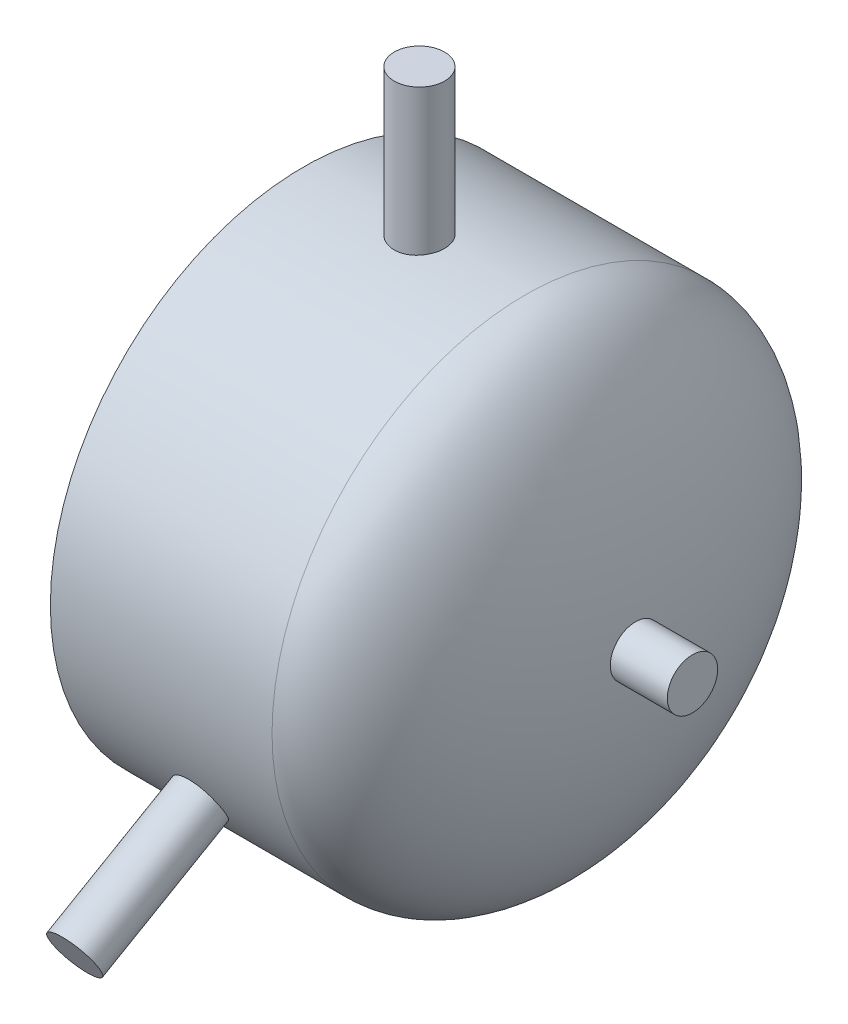
ISO-10303-21;
HEADER;
FILE_DESCRIPTION(('STEP AP214'),'2;1');
FILE_NAME('part.step','',(''),(''),'','','');
FILE_SCHEMA(('AUTOMOTIVE_DESIGN { 1 0 10303 214 1 1 1 1 }'));
ENDSEC;
DATA;
#1=APPLICATION_CONTEXT('core data for automotive mechanical design processes');
#2=APPLICATION_PROTOCOL_DEFINITION('international standard','automotive_design',2000,#1);
#3=PRODUCT_CONTEXT('',#1,'mechanical');
#4=PRODUCT('Part','Part','',(#3));
#5=PRODUCT_RELATED_PRODUCT_CATEGORY('part','',(#4));
#6=PRODUCT_DEFINITION_FORMATION('','',#4);
#7=PRODUCT_DEFINITION_CONTEXT('part definition',#1,'design');
#8=PRODUCT_DEFINITION('design','',#6,#7);
#9=PRODUCT_DEFINITION_SHAPE('','',#8);
#10=(LENGTH_UNIT() NAMED_UNIT(*) SI_UNIT(.MILLI.,.METRE.));
#11=(NAMED_UNIT(*) PLANE_ANGLE_UNIT() SI_UNIT($,.RADIAN.));
#12=(NAMED_UNIT(*) SI_UNIT($,.STERADIAN.) SOLID_ANGLE_UNIT());
#13=UNCERTAINTY_MEASURE_WITH_UNIT(LENGTH_MEASURE(1.E-05),#10,'distance_accuracy_value','');
#14=(GEOMETRIC_REPRESENTATION_CONTEXT(3) GLOBAL_UNCERTAINTY_ASSIGNED_CONTEXT((#13)) GLOBAL_UNIT_ASSIGNED_CONTEXT((#10,
#11,#12)) REPRESENTATION_CONTEXT('',''));
#15=CARTESIAN_POINT('',(0.,0.,0.));
#16=DIRECTION('',(0.,0.,1.));
#17=DIRECTION('',(1.,0.,0.));
#18=AXIS2_PLACEMENT_3D('',#15,#16,#17);
#19=CARTESIAN_POINT('',(38.1,0.,0.));
#20=DIRECTION('',(1.,0.,0.));
#21=DIRECTION('',(0.,0.,-1.));
#22=AXIS2_PLACEMENT_3D('',#19,#20,#21);
#23=PLANE('',#22);
#24=CARTESIAN_POINT('',(38.1,0.,0.));
#25=DIRECTION('',(-1.,0.,0.));
#26=DIRECTION('',(0.,0.,1.));
#27=AXIS2_PLACEMENT_3D('',#24,#25,#26);
#28=CIRCLE('',#27,6.35);
#29=CARTESIAN_POINT('',(38.1,0.,6.35));
#30=VERTEX_POINT('',#29);
#31=EDGE_CURVE('E11',#30,#30,#28,.T.);
#32=ORIENTED_EDGE('',*,*,#31,.T.);
#33=EDGE_LOOP('',(#32));
#34=FACE_BOUND('',#33,.T.);
#35=ADVANCED_FACE('F39',(#34),#23,.F.);
#36=CARTESIAN_POINT('',(-1078.06390114847,0.,0.));
#37=DIRECTION('',(-1.,0.,0.));
#38=DIRECTION('',(0.,0.,1.));
#39=AXIS2_PLACEMENT_3D('',#36,#37,#38);
#40=CYLINDRICAL_SURFACE('',#39,6.35);
#41=ORIENTED_EDGE('',*,*,#31,.F.);
#42=EDGE_LOOP('',(#41));
#43=FACE_BOUND('',#42,.T.);
#44=CARTESIAN_POINT('',(56.1339999999999,0.,0.));
#45=DIRECTION('',(-1.,0.,0.));
#46=DIRECTION('',(0.,0.,1.));
#47=AXIS2_PLACEMENT_3D('',#44,#45,#46);
#48=CIRCLE('',#47,6.35);
#49=CARTESIAN_POINT('',(56.1339999999999,0.,6.35));
#50=VERTEX_POINT('',#49);
#51=EDGE_CURVE('E45',#50,#50,#48,.T.);
#52=ORIENTED_EDGE('',*,*,#51,.T.);
#53=EDGE_LOOP('',(#52));
#54=FACE_BOUND('',#53,.T.);
#55=ADVANCED_FACE('F51',(#43,#54),#40,.T.);
#56=CARTESIAN_POINT('',(56.134,0.,0.));
#57=DIRECTION('',(-1.,0.,0.));
#58=DIRECTION('',(0.,0.,1.));
#59=AXIS2_PLACEMENT_3D('',#56,#57,#58);
#60=PLANE('',#59);
#61=ORIENTED_EDGE('',*,*,#51,.F.);
#62=EDGE_LOOP('',(#61));
#63=FACE_BOUND('',#62,.T.);
#64=ADVANCED_FACE('F53',(#63),#60,.F.);
#65=CLOSED_SHELL('',(#35,#55,#64));
#66=MANIFOLD_SOLID_BREP('B2',#65);
#67=CARTESIAN_POINT('',(-12.7,453.474919861809,785.441601158895));
#68=DIRECTION('',(0.,0.499999999999992,0.866025403784443));
#69=DIRECTION('',(0.,-0.866025403784443,0.499999999999992));
#70=AXIS2_PLACEMENT_3D('',#67,#68,#69);
#71=CYLINDRICAL_SURFACE('',#70,6.34999999999999);
#72=CARTESIAN_POINT('',(-12.7,-28.9559999999995,-50.1532631839646));
#73=DIRECTION('',(0.,0.499999999999992,0.866025403784443));
#74=DIRECTION('',(0.,-0.866025403784443,0.499999999999992));
#75=AXIS2_PLACEMENT_3D('',#72,#73,#74);
#76=CIRCLE('',#75,6.34999999999999);
#77=CARTESIAN_POINT('',(-12.7,-34.4552613140307,-46.9782631839647));
#78=VERTEX_POINT('',#77);
#79=EDGE_CURVE('E38',#78,#78,#76,.T.);
#80=ORIENTED_EDGE('',*,*,#79,.F.);
#81=EDGE_LOOP('',(#80));
#82=FACE_BOUND('',#81,.T.);
#83=CARTESIAN_POINT('',(-12.7,-50.1649999999992,-86.8883287616932));
#84=DIRECTION('',(0.,0.499999999999992,0.866025403784443));
#85=DIRECTION('',(0.,-0.866025403784443,0.499999999999992));
#86=AXIS2_PLACEMENT_3D('',#83,#84,#85);
#87=CIRCLE('',#86,6.35);
#88=CARTESIAN_POINT('',(-12.7,-55.6642613140304,-83.7133287616933));
#89=VERTEX_POINT('',#88);
#90=EDGE_CURVE('E93',#89,#89,#87,.T.);
#91=ORIENTED_EDGE('',*,*,#90,.T.);
#92=EDGE_LOOP('',(#91));
#93=FACE_BOUND('',#92,.T.);
#94=ADVANCED_FACE('F87',(#82,#93),#71,.T.);
#95=CARTESIAN_POINT('',(-19.05,-28.9559999999995,-50.1532631839647));
#96=DIRECTION('',(0.,-0.499999999999992,-0.866025403784443));
#97=DIRECTION('',(0.,0.866025403784443,-0.499999999999992));
#98=AXIS2_PLACEMENT_3D('',#95,#96,#97);
#99=PLANE('',#98);
#100=ORIENTED_EDGE('',*,*,#79,.T.);
#101=EDGE_LOOP('',(#100));
#102=FACE_BOUND('',#101,.T.);
#103=ADVANCED_FACE('F102',(#102),#99,.F.);
#104=CARTESIAN_POINT('',(-19.05,-50.1649999999992,-86.8883287616932));
#105=DIRECTION('',(0.,0.499999999999992,0.866025403784443));
#106=DIRECTION('',(0.,-0.866025403784443,0.499999999999992));
#107=AXIS2_PLACEMENT_3D('',#104,#105,#106);
#108=PLANE('',#107);
#109=ORIENTED_EDGE('',*,*,#90,.F.);
#110=EDGE_LOOP('',(#109));
#111=FACE_BOUND('',#110,.T.);
#112=ADVANCED_FACE('F100',(#111),#108,.F.);
#113=CLOSED_SHELL('',(#94,#103,#112));
#114=MANIFOLD_SOLID_BREP('B6',#113);
#115=CARTESIAN_POINT('',(-12.7,453.47491986182,-785.441601158888));
#116=DIRECTION('',(0.,0.500000000000004,-0.866025403784436));
#117=DIRECTION('',(0.,0.866025403784436,0.500000000000004));
#118=AXIS2_PLACEMENT_3D('',#115,#116,#117);
#119=CYLINDRICAL_SURFACE('',#118,6.34999999999999);
#120=CARTESIAN_POINT('',(-12.7,-28.9560000000002,50.1532631839643));
#121=DIRECTION('',(0.,0.500000000000004,-0.866025403784436));
#122=DIRECTION('',(0.,0.866025403784436,0.500000000000004));
#123=AXIS2_PLACEMENT_3D('',#120,#121,#122);
#124=CIRCLE('',#123,6.34999999999999);
#125=CARTESIAN_POINT('',(-12.7,-23.4567386859691,53.3282631839643));
#126=VERTEX_POINT('',#125);
#127=EDGE_CURVE('E86',#126,#126,#124,.T.);
#128=ORIENTED_EDGE('',*,*,#127,.F.);
#129=EDGE_LOOP('',(#128));
#130=FACE_BOUND('',#129,.T.);
#131=CARTESIAN_POINT('',(-12.7,-50.1650000000004,86.8883287616925));
#132=DIRECTION('',(0.,0.500000000000004,-0.866025403784436));
#133=DIRECTION('',(0.,0.866025403784436,0.500000000000004));
#134=AXIS2_PLACEMENT_3D('',#131,#132,#133);
#135=CIRCLE('',#134,6.35);
#136=CARTESIAN_POINT('',(-12.7,-44.6657386859693,90.0633287616926));
#137=VERTEX_POINT('',#136);
#138=EDGE_CURVE('E141',#137,#137,#135,.T.);
#139=ORIENTED_EDGE('',*,*,#138,.T.);
#140=EDGE_LOOP('',(#139));
#141=FACE_BOUND('',#140,.T.);
#142=ADVANCED_FACE('F135',(#130,#141),#119,.T.);
#143=CARTESIAN_POINT('',(-19.05,-28.9560000000002,50.1532631839643));
#144=DIRECTION('',(0.,-0.500000000000004,0.866025403784436));
#145=DIRECTION('',(0.,-0.866025403784436,-0.500000000000004));
#146=AXIS2_PLACEMENT_3D('',#143,#144,#145);
#147=PLANE('',#146);
#148=ORIENTED_EDGE('',*,*,#127,.T.);
#149=EDGE_LOOP('',(#148));
#150=FACE_BOUND('',#149,.T.);
#151=ADVANCED_FACE('F150',(#150),#147,.F.);
#152=CARTESIAN_POINT('',(-19.05,-50.1650000000004,86.8883287616925));
#153=DIRECTION('',(0.,0.500000000000004,-0.866025403784436));
#154=DIRECTION('',(0.,0.866025403784436,0.500000000000004));
#155=AXIS2_PLACEMENT_3D('',#152,#153,#154);
#156=PLANE('',#155);
#157=ORIENTED_EDGE('',*,*,#138,.F.);
#158=EDGE_LOOP('',(#157));
#159=FACE_BOUND('',#158,.T.);
#160=ADVANCED_FACE('F148',(#159),#156,.F.);
#161=CLOSED_SHELL('',(#142,#151,#160));
#162=MANIFOLD_SOLID_BREP('B33',#161);
#163=CARTESIAN_POINT('',(-12.7,-906.949839723632,0.));
#164=DIRECTION('',(0.,-1.,0.));
#165=DIRECTION('',(0.,0.,-1.));
#166=AXIS2_PLACEMENT_3D('',#163,#164,#165);
#167=CYLINDRICAL_SURFACE('',#166,6.34999999999999);
#168=CARTESIAN_POINT('',(-12.7,57.912,0.));
#169=DIRECTION('',(0.,-1.,0.));
#170=DIRECTION('',(0.,0.,-1.));
#171=AXIS2_PLACEMENT_3D('',#168,#169,#170);
#172=CIRCLE('',#171,6.34999999999999);
#173=CARTESIAN_POINT('',(-12.7,57.912,-6.34999999999999));
#174=VERTEX_POINT('',#173);
#175=EDGE_CURVE('E134',#174,#174,#172,.T.);
#176=ORIENTED_EDGE('',*,*,#175,.F.);
#177=EDGE_LOOP('',(#176));
#178=FACE_BOUND('',#177,.T.);
#179=CARTESIAN_POINT('',(-12.7,100.33,0.));
#180=DIRECTION('',(0.,-1.,0.));
#181=DIRECTION('',(0.,0.,-1.));
#182=AXIS2_PLACEMENT_3D('',#179,#180,#181);
#183=CIRCLE('',#182,6.35);
#184=CARTESIAN_POINT('',(-12.7,100.33,-6.35));
#185=VERTEX_POINT('',#184);
#186=EDGE_CURVE('E190',#185,#185,#183,.T.);
#187=ORIENTED_EDGE('',*,*,#186,.T.);
#188=EDGE_LOOP('',(#187));
#189=FACE_BOUND('',#188,.T.);
#190=ADVANCED_FACE('F184',(#178,#189),#167,.T.);
#191=CARTESIAN_POINT('',(-19.05,57.912,0.));
#192=DIRECTION('',(0.,1.,0.));
#193=DIRECTION('',(0.,0.,1.));
#194=AXIS2_PLACEMENT_3D('',#191,#192,#193);
#195=PLANE('',#194);
#196=ORIENTED_EDGE('',*,*,#175,.T.);
#197=EDGE_LOOP('',(#196));
#198=FACE_BOUND('',#197,.T.);
#199=ADVANCED_FACE('F199',(#198),#195,.F.);
#200=CARTESIAN_POINT('',(-19.05,100.33,0.));
#201=DIRECTION('',(0.,-1.,0.));
#202=DIRECTION('',(0.,0.,-1.));
#203=AXIS2_PLACEMENT_3D('',#200,#201,#202);
#204=PLANE('',#203);
#205=ORIENTED_EDGE('',*,*,#186,.F.);
#206=EDGE_LOOP('',(#205));
#207=FACE_BOUND('',#206,.T.);
#208=ADVANCED_FACE('F197',(#207),#204,.F.);
#209=CLOSED_SHELL('',(#190,#199,#208));
#210=MANIFOLD_SOLID_BREP('B81',#209);
#211=CARTESIAN_POINT('',(-41.91,0.,0.));
#212=DIRECTION('',(-1.,0.,0.));
#213=DIRECTION('',(0.,0.,1.));
#214=AXIS2_PLACEMENT_3D('',#211,#212,#213);
#215=CYLINDRICAL_SURFACE('',#214,63.8175);
#216=CARTESIAN_POINT('',(13.97,0.,0.));
#217=DIRECTION('',(-1.,0.,0.));
#218=DIRECTION('',(0.,0.,1.));
#219=AXIS2_PLACEMENT_3D('',#216,#217,#218);
#220=CIRCLE('',#219,63.8175);
#221=CARTESIAN_POINT('',(13.97,0.,63.8175));
#222=VERTEX_POINT('',#221);
#223=EDGE_CURVE('E182',#222,#222,#220,.T.);
#224=ORIENTED_EDGE('',*,*,#223,.T.);
#225=EDGE_LOOP('',(#224));
#226=FACE_BOUND('',#225,.T.);
#227=CARTESIAN_POINT('',(-41.91,0.,0.));
#228=DIRECTION('',(-1.,0.,0.));
#229=DIRECTION('',(0.,0.,1.));
#230=AXIS2_PLACEMENT_3D('',#227,#228,#229);
#231=CIRCLE('',#230,63.8175);
#232=CARTESIAN_POINT('',(-41.91,0.,63.8175));
#233=VERTEX_POINT('',#232);
#234=EDGE_CURVE('E247',#233,#233,#231,.T.);
#235=ORIENTED_EDGE('',*,*,#234,.F.);
#236=EDGE_LOOP('',(#235));
#237=FACE_BOUND('',#236,.T.);
#238=ADVANCED_FACE('F224',(#226,#237),#215,.T.);
#239=CARTESIAN_POINT('',(13.97,0.,0.));
#240=DIRECTION('',(0.,0.,1.));
#241=DIRECTION('',(0.,1.,0.));
#242=AXIS2_PLACEMENT_3D('',#239,#240,#241);
#243=ELLIPSE('',#242,63.8175,27.94);
#244=TRIMMED_CURVE('',#243,(PARAMETER_VALUE(1.5707963267949)),
(PARAMETER_VALUE(4.71238898038469)),.T.,.PARAMETER.);
#245=CARTESIAN_POINT('',(-41.91,0.,0.));
#246=DIRECTION('',(-1.,0.,0.));
#247=AXIS1_PLACEMENT('',#245,#246);
#248=SURFACE_OF_REVOLUTION('',#244,#247);
#249=CARTESIAN_POINT('',(41.91,0.,0.));
#250=VERTEX_POINT('',#249);
#251=VERTEX_LOOP('',#250);
#252=FACE_BOUND('',#251,.T.);
#253=ORIENTED_EDGE('',*,*,#223,.F.);
#254=EDGE_LOOP('',(#253));
#255=FACE_BOUND('',#254,.T.);
#256=ADVANCED_FACE('F237',(#252,#255),#248,.F.);
#257=CARTESIAN_POINT('',(13.97,0.,0.));
#258=DIRECTION('',(0.,0.,-1.));
#259=DIRECTION('',(0.,-1.,0.));
#260=AXIS2_PLACEMENT_3D('',#257,#258,#259);
#261=ELLIPSE('',#260,57.0357,21.1582);
#262=TRIMMED_CURVE('',#261,(PARAMETER_VALUE(4.71238898038469)),
(PARAMETER_VALUE(7.85398163397448)),.T.,.PARAMETER.);
#263=CARTESIAN_POINT('',(-41.91,0.,0.));
#264=DIRECTION('',(-1.,0.,0.));
#265=AXIS1_PLACEMENT('',#263,#264);
#266=SURFACE_OF_REVOLUTION('',#262,#265);
#267=CARTESIAN_POINT('',(13.97,0.,0.));
#268=DIRECTION('',(-1.,0.,0.));
#269=DIRECTION('',(0.,0.,1.));
#270=AXIS2_PLACEMENT_3D('',#267,#268,#269);
#271=CIRCLE('',#270,57.0357);
#272=CARTESIAN_POINT('',(13.97,0.,57.0357));
#273=VERTEX_POINT('',#272);
#274=EDGE_CURVE('E231',#273,#273,#271,.T.);
#275=ORIENTED_EDGE('',*,*,#274,.T.);
#276=EDGE_LOOP('',(#275));
#277=FACE_BOUND('',#276,.T.);
#278=CARTESIAN_POINT('',(35.1282,0.,0.));
#279=VERTEX_POINT('',#278);
#280=VERTEX_LOOP('',#279);
#281=FACE_BOUND('',#280,.T.);
#282=ADVANCED_FACE('F240',(#277,#281),#266,.F.);
#283=CARTESIAN_POINT('',(13.97,0.,0.));
#284=DIRECTION('',(-1.,0.,0.));
#285=DIRECTION('',(0.,0.,1.));
#286=AXIS2_PLACEMENT_3D('',#283,#284,#285);
#287=CONICAL_SURFACE('',#286,57.0357,0.00613628661659735);
#288=CARTESIAN_POINT('',(-41.91,0.,0.));
#289=DIRECTION('',(-1.,0.,0.));
#290=DIRECTION('',(0.,0.,1.));
#291=AXIS2_PLACEMENT_3D('',#288,#289,#290);
#292=CIRCLE('',#291,57.3786);
#293=CARTESIAN_POINT('',(-41.91,0.,57.3786));
#294=VERTEX_POINT('',#293);
#295=EDGE_CURVE('E249',#294,#294,#292,.T.);
#296=ORIENTED_EDGE('',*,*,#295,.T.);
#297=EDGE_LOOP('',(#296));
#298=FACE_BOUND('',#297,.T.);
#299=ORIENTED_EDGE('',*,*,#274,.F.);
#300=EDGE_LOOP('',(#299));
#301=FACE_BOUND('',#300,.T.);
#302=ADVANCED_FACE('F260',(#298,#301),#287,.F.);
#303=CARTESIAN_POINT('',(-41.91,-63.8175,0.));
#304=DIRECTION('',(-1.,0.,0.));
#305=DIRECTION('',(0.,0.,1.));
#306=AXIS2_PLACEMENT_3D('',#303,#304,#305);
#307=PLANE('',#306);
#308=ORIENTED_EDGE('',*,*,#234,.T.);
#309=EDGE_LOOP('',(#308));
#310=FACE_BOUND('',#309,.T.);
#311=ORIENTED_EDGE('',*,*,#295,.F.);
#312=EDGE_LOOP('',(#311));
#313=FACE_BOUND('',#312,.T.);
#314=ADVANCED_FACE('F262',(#310,#313),#307,.T.);
#315=CLOSED_SHELL('',(#238,#256,#282,#302,#314));
#316=MANIFOLD_SOLID_BREP('B129',#315);
#317=ADVANCED_BREP_SHAPE_REPRESENTATION('',(#18,#66,#114,#162,#210,#316),#14);
#318=SHAPE_DEFINITION_REPRESENTATION(#9,#317);
ENDSEC;
END-ISO-10303-21;
